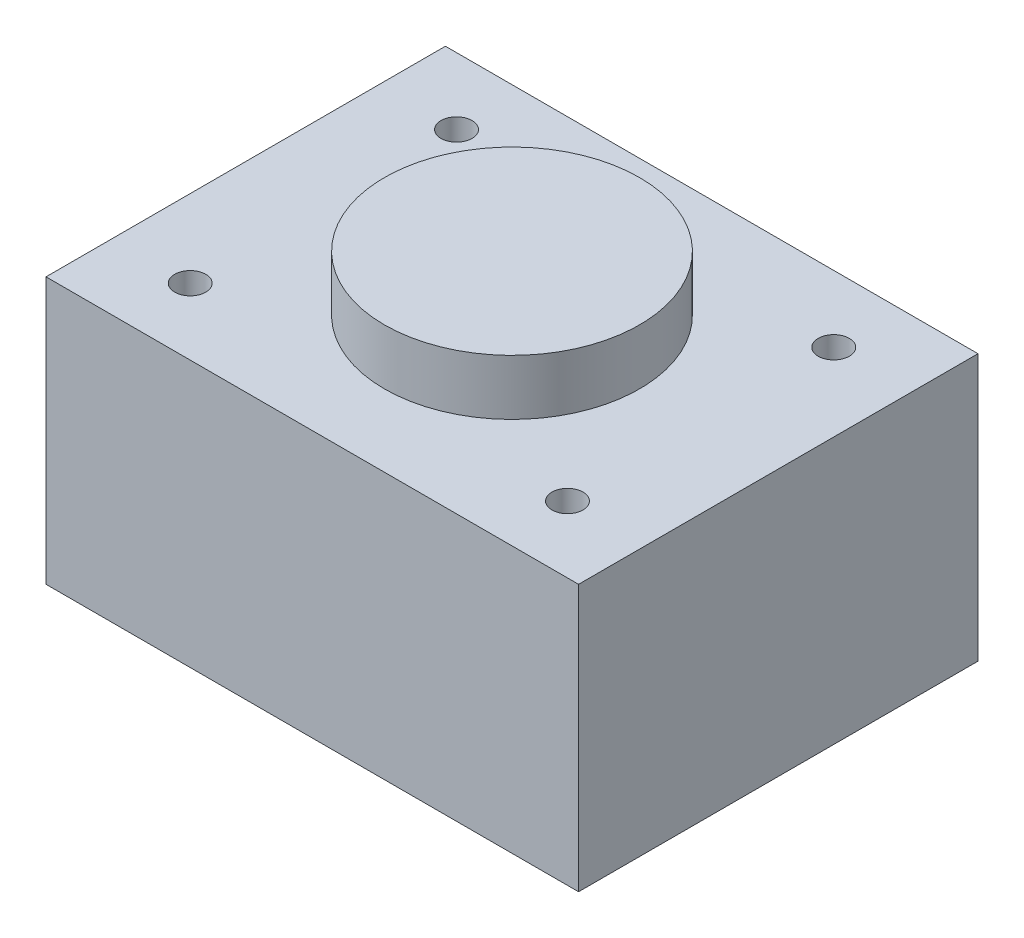
ISO-10303-21;
HEADER;
FILE_DESCRIPTION(('STEP AP214'),'2;1');
FILE_NAME('part.step','',(''),(''),'','','');
FILE_SCHEMA(('AUTOMOTIVE_DESIGN { 1 0 10303 214 1 1 1 1 }'));
ENDSEC;
DATA;
#1=APPLICATION_CONTEXT('core data for automotive mechanical design processes');
#2=APPLICATION_PROTOCOL_DEFINITION('international standard','automotive_design',2000,#1);
#3=PRODUCT_CONTEXT('',#1,'mechanical');
#4=PRODUCT('Part','Part','',(#3));
#5=PRODUCT_RELATED_PRODUCT_CATEGORY('part','',(#4));
#6=PRODUCT_DEFINITION_FORMATION('','',#4);
#7=PRODUCT_DEFINITION_CONTEXT('part definition',#1,'design');
#8=PRODUCT_DEFINITION('design','',#6,#7);
#9=PRODUCT_DEFINITION_SHAPE('','',#8);
#10=(LENGTH_UNIT() NAMED_UNIT(*) SI_UNIT(.MILLI.,.METRE.));
#11=(NAMED_UNIT(*) PLANE_ANGLE_UNIT() SI_UNIT($,.RADIAN.));
#12=(NAMED_UNIT(*) SI_UNIT($,.STERADIAN.) SOLID_ANGLE_UNIT());
#13=UNCERTAINTY_MEASURE_WITH_UNIT(LENGTH_MEASURE(1.E-05),#10,'distance_accuracy_value','');
#14=(GEOMETRIC_REPRESENTATION_CONTEXT(3) GLOBAL_UNCERTAINTY_ASSIGNED_CONTEXT((#13)) GLOBAL_UNIT_ASSIGNED_CONTEXT((#10,
#11,#12)) REPRESENTATION_CONTEXT('',''));
#15=CARTESIAN_POINT('',(0.,0.,0.));
#16=DIRECTION('',(0.,0.,1.));
#17=DIRECTION('',(1.,0.,0.));
#18=AXIS2_PLACEMENT_3D('',#15,#16,#17);
#19=CARTESIAN_POINT('',(0.,120.,0.));
#20=DIRECTION('',(0.,-1.,0.));
#21=DIRECTION('',(0.,0.,-1.));
#22=AXIS2_PLACEMENT_3D('',#19,#20,#21);
#23=PLANE('',#22);
#24=CARTESIAN_POINT('',(0.,120.,0.));
#25=DIRECTION('',(0.,-1.,0.));
#26=DIRECTION('',(0.,0.,-1.));
#27=AXIS2_PLACEMENT_3D('',#24,#25,#26);
#28=CIRCLE('',#27,57.5);
#29=CARTESIAN_POINT('',(0.,120.,-57.5));
#30=VERTEX_POINT('',#29);
#31=EDGE_CURVE('E11',#30,#30,#28,.F.);
#32=ORIENTED_EDGE('',*,*,#31,.F.);
#33=EDGE_LOOP('',(#32));
#34=FACE_BOUND('',#33,.T.);
#35=DIRECTION('',(0.,0.,-1.));
#36=VECTOR('',#35,1.);
#37=CARTESIAN_POINT('',(120.,120.,90.));
#38=LINE('',#37,#36);
#39=CARTESIAN_POINT('',(120.,120.,90.));
#40=VERTEX_POINT('',#39);
#41=CARTESIAN_POINT('',(120.,120.,-90.));
#42=VERTEX_POINT('',#41);
#43=EDGE_CURVE('E93',#40,#42,#38,.T.);
#44=ORIENTED_EDGE('',*,*,#43,.T.);
#45=DIRECTION('',(-1.,0.,0.));
#46=VECTOR('',#45,1.);
#47=CARTESIAN_POINT('',(-120.,120.,-90.));
#48=LINE('',#47,#46);
#49=CARTESIAN_POINT('',(-120.,120.,-90.));
#50=VERTEX_POINT('',#49);
#51=EDGE_CURVE('E88',#42,#50,#48,.T.);
#52=ORIENTED_EDGE('',*,*,#51,.T.);
#53=DIRECTION('',(0.,0.,1.));
#54=VECTOR('',#53,1.);
#55=CARTESIAN_POINT('',(-120.,120.,90.));
#56=LINE('',#55,#54);
#57=CARTESIAN_POINT('',(-120.,120.,90.));
#58=VERTEX_POINT('',#57);
#59=EDGE_CURVE('E91',#50,#58,#56,.T.);
#60=ORIENTED_EDGE('',*,*,#59,.T.);
#61=DIRECTION('',(1.,0.,0.));
#62=VECTOR('',#61,1.);
#63=CARTESIAN_POINT('',(-120.,120.,90.));
#64=LINE('',#63,#62);
#65=EDGE_CURVE('E57',#58,#40,#64,.T.);
#66=ORIENTED_EDGE('',*,*,#65,.T.);
#67=EDGE_LOOP('',(#44,#52,#60,#66));
#68=FACE_BOUND('',#67,.T.);
#69=CARTESIAN_POINT('',(-85.,120.,60.));
#70=DIRECTION('',(0.,1.,0.));
#71=DIRECTION('',(0.,0.,1.));
#72=AXIS2_PLACEMENT_3D('',#69,#70,#71);
#73=CIRCLE('',#72,7.);
#74=CARTESIAN_POINT('',(-85.,120.,67.));
#75=VERTEX_POINT('',#74);
#76=EDGE_CURVE('E109',#75,#75,#73,.T.);
#77=ORIENTED_EDGE('',*,*,#76,.F.);
#78=EDGE_LOOP('',(#77));
#79=FACE_BOUND('',#78,.T.);
#80=CARTESIAN_POINT('',(85.,120.,60.));
#81=DIRECTION('',(0.,1.,0.));
#82=DIRECTION('',(0.,0.,1.));
#83=AXIS2_PLACEMENT_3D('',#80,#81,#82);
#84=CIRCLE('',#83,7.);
#85=CARTESIAN_POINT('',(85.,120.,67.));
#86=VERTEX_POINT('',#85);
#87=EDGE_CURVE('E124',#86,#86,#84,.T.);
#88=ORIENTED_EDGE('',*,*,#87,.F.);
#89=EDGE_LOOP('',(#88));
#90=FACE_BOUND('',#89,.T.);
#91=CARTESIAN_POINT('',(-85.,120.,-60.));
#92=DIRECTION('',(0.,1.,0.));
#93=DIRECTION('',(0.,0.,1.));
#94=AXIS2_PLACEMENT_3D('',#91,#92,#93);
#95=CIRCLE('',#94,7.);
#96=CARTESIAN_POINT('',(-85.,120.,-53.));
#97=VERTEX_POINT('',#96);
#98=EDGE_CURVE('E130',#97,#97,#95,.T.);
#99=ORIENTED_EDGE('',*,*,#98,.F.);
#100=EDGE_LOOP('',(#99));
#101=FACE_BOUND('',#100,.T.);
#102=CARTESIAN_POINT('',(85.,120.,-60.));
#103=DIRECTION('',(0.,1.,0.));
#104=DIRECTION('',(0.,0.,1.));
#105=AXIS2_PLACEMENT_3D('',#102,#103,#104);
#106=CIRCLE('',#105,7.);
#107=CARTESIAN_POINT('',(85.,120.,-53.));
#108=VERTEX_POINT('',#107);
#109=EDGE_CURVE('E136',#108,#108,#106,.T.);
#110=ORIENTED_EDGE('',*,*,#109,.F.);
#111=EDGE_LOOP('',(#110));
#112=FACE_BOUND('',#111,.T.);
#113=ADVANCED_FACE('F39',(#34,#68,#79,#90,#101,#112),#23,.F.);
#114=CARTESIAN_POINT('',(0.,0.,0.));
#115=DIRECTION('',(0.,-1.,0.));
#116=DIRECTION('',(0.,0.,-1.));
#117=AXIS2_PLACEMENT_3D('',#114,#115,#116);
#118=PLANE('',#117);
#119=CARTESIAN_POINT('',(-85.,0.,-60.));
#120=DIRECTION('',(0.,1.,0.));
#121=DIRECTION('',(0.,0.,1.));
#122=AXIS2_PLACEMENT_3D('',#119,#120,#121);
#123=CIRCLE('',#122,7.);
#124=CARTESIAN_POINT('',(-85.,0.,-53.));
#125=VERTEX_POINT('',#124);
#126=EDGE_CURVE('E133',#125,#125,#123,.T.);
#127=ORIENTED_EDGE('',*,*,#126,.T.);
#128=EDGE_LOOP('',(#127));
#129=FACE_BOUND('',#128,.T.);
#130=CARTESIAN_POINT('',(-85.,0.,60.));
#131=DIRECTION('',(0.,1.,0.));
#132=DIRECTION('',(0.,0.,1.));
#133=AXIS2_PLACEMENT_3D('',#130,#131,#132);
#134=CIRCLE('',#133,7.);
#135=CARTESIAN_POINT('',(-85.,0.,67.));
#136=VERTEX_POINT('',#135);
#137=EDGE_CURVE('E121',#136,#136,#134,.T.);
#138=ORIENTED_EDGE('',*,*,#137,.T.);
#139=EDGE_LOOP('',(#138));
#140=FACE_BOUND('',#139,.T.);
#141=DIRECTION('',(0.,0.,-1.));
#142=VECTOR('',#141,1.);
#143=CARTESIAN_POINT('',(120.,0.,90.));
#144=LINE('',#143,#142);
#145=CARTESIAN_POINT('',(120.,0.,90.));
#146=VERTEX_POINT('',#145);
#147=CARTESIAN_POINT('',(120.,0.,-90.));
#148=VERTEX_POINT('',#147);
#149=EDGE_CURVE('E106',#146,#148,#144,.T.);
#150=ORIENTED_EDGE('',*,*,#149,.F.);
#151=DIRECTION('',(1.,0.,0.));
#152=VECTOR('',#151,1.);
#153=CARTESIAN_POINT('',(-120.,0.,90.));
#154=LINE('',#153,#152);
#155=CARTESIAN_POINT('',(-120.,0.,90.));
#156=VERTEX_POINT('',#155);
#157=EDGE_CURVE('E80',#156,#146,#154,.T.);
#158=ORIENTED_EDGE('',*,*,#157,.F.);
#159=DIRECTION('',(0.,0.,1.));
#160=VECTOR('',#159,1.);
#161=CARTESIAN_POINT('',(-120.,0.,90.));
#162=LINE('',#161,#160);
#163=CARTESIAN_POINT('',(-120.,0.,-90.));
#164=VERTEX_POINT('',#163);
#165=EDGE_CURVE('E74',#164,#156,#162,.T.);
#166=ORIENTED_EDGE('',*,*,#165,.F.);
#167=DIRECTION('',(-1.,0.,0.));
#168=VECTOR('',#167,1.);
#169=CARTESIAN_POINT('',(-120.,0.,-90.));
#170=LINE('',#169,#168);
#171=EDGE_CURVE('E98',#148,#164,#170,.T.);
#172=ORIENTED_EDGE('',*,*,#171,.F.);
#173=EDGE_LOOP('',(#150,#158,#166,#172));
#174=FACE_BOUND('',#173,.T.);
#175=CARTESIAN_POINT('',(85.,0.,60.));
#176=DIRECTION('',(0.,1.,0.));
#177=DIRECTION('',(0.,0.,1.));
#178=AXIS2_PLACEMENT_3D('',#175,#176,#177);
#179=CIRCLE('',#178,7.);
#180=CARTESIAN_POINT('',(85.,0.,67.));
#181=VERTEX_POINT('',#180);
#182=EDGE_CURVE('E127',#181,#181,#179,.T.);
#183=ORIENTED_EDGE('',*,*,#182,.T.);
#184=EDGE_LOOP('',(#183));
#185=FACE_BOUND('',#184,.T.);
#186=CARTESIAN_POINT('',(85.,0.,-60.));
#187=DIRECTION('',(0.,1.,0.));
#188=DIRECTION('',(0.,0.,1.));
#189=AXIS2_PLACEMENT_3D('',#186,#187,#188);
#190=CIRCLE('',#189,7.);
#191=CARTESIAN_POINT('',(85.,0.,-53.));
#192=VERTEX_POINT('',#191);
#193=EDGE_CURVE('E139',#192,#192,#190,.T.);
#194=ORIENTED_EDGE('',*,*,#193,.T.);
#195=EDGE_LOOP('',(#194));
#196=FACE_BOUND('',#195,.T.);
#197=ADVANCED_FACE('F117',(#129,#140,#174,#185,#196),#118,.T.);
#198=CARTESIAN_POINT('',(120.,120.,90.));
#199=DIRECTION('',(-1.,0.,0.));
#200=DIRECTION('',(0.,0.,1.));
#201=AXIS2_PLACEMENT_3D('',#198,#199,#200);
#202=PLANE('',#201);
#203=ORIENTED_EDGE('',*,*,#149,.T.);
#204=DIRECTION('',(0.,-1.,0.));
#205=VECTOR('',#204,1.);
#206=CARTESIAN_POINT('',(120.,120.,-90.));
#207=LINE('',#206,#205);
#208=EDGE_CURVE('E43',#42,#148,#207,.T.);
#209=ORIENTED_EDGE('',*,*,#208,.F.);
#210=ORIENTED_EDGE('',*,*,#43,.F.);
#211=DIRECTION('',(0.,-1.,0.));
#212=VECTOR('',#211,1.);
#213=CARTESIAN_POINT('',(120.,120.,90.));
#214=LINE('',#213,#212);
#215=EDGE_CURVE('E102',#40,#146,#214,.T.);
#216=ORIENTED_EDGE('',*,*,#215,.T.);
#217=EDGE_LOOP('',(#203,#209,#210,#216));
#218=FACE_BOUND('',#217,.T.);
#219=ADVANCED_FACE('F41',(#218),#202,.F.);
#220=CARTESIAN_POINT('',(-120.,120.,-90.));
#221=DIRECTION('',(0.,0.,1.));
#222=DIRECTION('',(1.,0.,0.));
#223=AXIS2_PLACEMENT_3D('',#220,#221,#222);
#224=PLANE('',#223);
#225=ORIENTED_EDGE('',*,*,#171,.T.);
#226=DIRECTION('',(0.,-1.,0.));
#227=VECTOR('',#226,1.);
#228=CARTESIAN_POINT('',(-120.,120.,-90.));
#229=LINE('',#228,#227);
#230=EDGE_CURVE('E96',#50,#164,#229,.T.);
#231=ORIENTED_EDGE('',*,*,#230,.F.);
#232=ORIENTED_EDGE('',*,*,#51,.F.);
#233=ORIENTED_EDGE('',*,*,#208,.T.);
#234=EDGE_LOOP('',(#225,#231,#232,#233));
#235=FACE_BOUND('',#234,.T.);
#236=ADVANCED_FACE('F97',(#235),#224,.F.);
#237=CARTESIAN_POINT('',(-120.,120.,90.));
#238=DIRECTION('',(1.,0.,0.));
#239=DIRECTION('',(0.,0.,-1.));
#240=AXIS2_PLACEMENT_3D('',#237,#238,#239);
#241=PLANE('',#240);
#242=ORIENTED_EDGE('',*,*,#165,.T.);
#243=DIRECTION('',(0.,-1.,0.));
#244=VECTOR('',#243,1.);
#245=CARTESIAN_POINT('',(-120.,120.,90.));
#246=LINE('',#245,#244);
#247=EDGE_CURVE('E99',#58,#156,#246,.T.);
#248=ORIENTED_EDGE('',*,*,#247,.F.);
#249=ORIENTED_EDGE('',*,*,#59,.F.);
#250=ORIENTED_EDGE('',*,*,#230,.T.);
#251=EDGE_LOOP('',(#242,#248,#249,#250));
#252=FACE_BOUND('',#251,.T.);
#253=ADVANCED_FACE('F100',(#252),#241,.F.);
#254=CARTESIAN_POINT('',(-120.,120.,90.));
#255=DIRECTION('',(0.,0.,-1.));
#256=DIRECTION('',(-1.,0.,0.));
#257=AXIS2_PLACEMENT_3D('',#254,#255,#256);
#258=PLANE('',#257);
#259=ORIENTED_EDGE('',*,*,#157,.T.);
#260=ORIENTED_EDGE('',*,*,#215,.F.);
#261=ORIENTED_EDGE('',*,*,#65,.F.);
#262=ORIENTED_EDGE('',*,*,#247,.T.);
#263=EDGE_LOOP('',(#259,#260,#261,#262));
#264=FACE_BOUND('',#263,.T.);
#265=ADVANCED_FACE('F114',(#264),#258,.F.);
#266=CARTESIAN_POINT('',(-85.,120.,60.));
#267=DIRECTION('',(0.,-1.,0.));
#268=DIRECTION('',(0.,0.,-1.));
#269=AXIS2_PLACEMENT_3D('',#266,#267,#268);
#270=CYLINDRICAL_SURFACE('',#269,7.);
#271=ORIENTED_EDGE('',*,*,#76,.T.);
#272=EDGE_LOOP('',(#271));
#273=FACE_BOUND('',#272,.T.);
#274=ORIENTED_EDGE('',*,*,#137,.F.);
#275=EDGE_LOOP('',(#274));
#276=FACE_BOUND('',#275,.T.);
#277=ADVANCED_FACE('F165',(#273,#276),#270,.F.);
#278=CARTESIAN_POINT('',(85.,120.,60.));
#279=DIRECTION('',(0.,-1.,0.));
#280=DIRECTION('',(0.,0.,-1.));
#281=AXIS2_PLACEMENT_3D('',#278,#279,#280);
#282=CYLINDRICAL_SURFACE('',#281,7.);
#283=ORIENTED_EDGE('',*,*,#87,.T.);
#284=EDGE_LOOP('',(#283));
#285=FACE_BOUND('',#284,.T.);
#286=ORIENTED_EDGE('',*,*,#182,.F.);
#287=EDGE_LOOP('',(#286));
#288=FACE_BOUND('',#287,.T.);
#289=ADVANCED_FACE('F221',(#285,#288),#282,.F.);
#290=CARTESIAN_POINT('',(-85.,120.,-60.));
#291=DIRECTION('',(0.,-1.,0.));
#292=DIRECTION('',(0.,0.,-1.));
#293=AXIS2_PLACEMENT_3D('',#290,#291,#292);
#294=CYLINDRICAL_SURFACE('',#293,7.);
#295=ORIENTED_EDGE('',*,*,#98,.T.);
#296=EDGE_LOOP('',(#295));
#297=FACE_BOUND('',#296,.T.);
#298=ORIENTED_EDGE('',*,*,#126,.F.);
#299=EDGE_LOOP('',(#298));
#300=FACE_BOUND('',#299,.T.);
#301=ADVANCED_FACE('F212',(#297,#300),#294,.F.);
#302=CARTESIAN_POINT('',(85.,120.,-60.));
#303=DIRECTION('',(0.,-1.,0.));
#304=DIRECTION('',(0.,0.,-1.));
#305=AXIS2_PLACEMENT_3D('',#302,#303,#304);
#306=CYLINDRICAL_SURFACE('',#305,7.);
#307=ORIENTED_EDGE('',*,*,#109,.T.);
#308=EDGE_LOOP('',(#307));
#309=FACE_BOUND('',#308,.T.);
#310=ORIENTED_EDGE('',*,*,#193,.F.);
#311=EDGE_LOOP('',(#310));
#312=FACE_BOUND('',#311,.T.);
#313=ADVANCED_FACE('F153',(#309,#312),#306,.F.);
#314=CARTESIAN_POINT('',(0.,145.,0.));
#315=DIRECTION('',(0.,-1.,0.));
#316=DIRECTION('',(0.,0.,-1.));
#317=AXIS2_PLACEMENT_3D('',#314,#315,#316);
#318=CYLINDRICAL_SURFACE('',#317,57.5);
#319=CARTESIAN_POINT('',(0.,145.,0.));
#320=DIRECTION('',(0.,1.,0.));
#321=DIRECTION('',(0.,0.,1.));
#322=AXIS2_PLACEMENT_3D('',#319,#320,#321);
#323=CIRCLE('',#322,57.5);
#324=CARTESIAN_POINT('',(0.,145.,57.5));
#325=VERTEX_POINT('',#324);
#326=EDGE_CURVE('E142',#325,#325,#323,.T.);
#327=ORIENTED_EDGE('',*,*,#326,.F.);
#328=EDGE_LOOP('',(#327));
#329=FACE_BOUND('',#328,.T.);
#330=ORIENTED_EDGE('',*,*,#31,.T.);
#331=EDGE_LOOP('',(#330));
#332=FACE_BOUND('',#331,.T.);
#333=ADVANCED_FACE('F150',(#329,#332),#318,.T.);
#334=CARTESIAN_POINT('',(0.,145.,0.));
#335=DIRECTION('',(0.,1.,0.));
#336=DIRECTION('',(0.,0.,1.));
#337=AXIS2_PLACEMENT_3D('',#334,#335,#336);
#338=PLANE('',#337);
#339=ORIENTED_EDGE('',*,*,#326,.T.);
#340=EDGE_LOOP('',(#339));
#341=FACE_BOUND('',#340,.T.);
#342=ADVANCED_FACE('F148',(#341),#338,.T.);
#343=CLOSED_SHELL('',(#113,#197,#219,#236,#253,#265,#277,#289,#301,#313,#333,#342));
#344=MANIFOLD_SOLID_BREP('B2',#343);
#345=ADVANCED_BREP_SHAPE_REPRESENTATION('',(#18,#344),#14);
#346=SHAPE_DEFINITION_REPRESENTATION(#9,#345);
ENDSEC;
END-ISO-10303-21;
